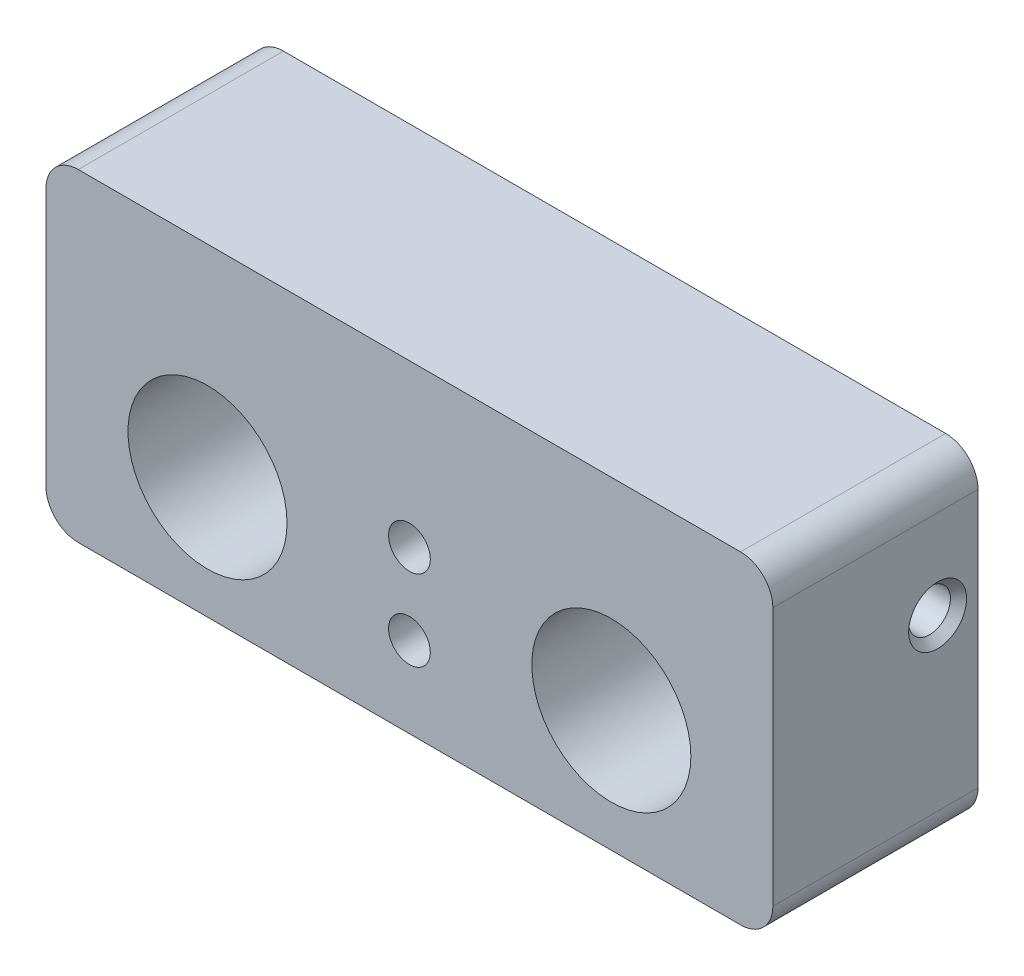
ISO-10303-21;
HEADER;
FILE_DESCRIPTION(('STEP AP214'),'2;1');
FILE_NAME('part.step','',(''),(''),'','','');
FILE_SCHEMA(('AUTOMOTIVE_DESIGN { 1 0 10303 214 1 1 1 1 }'));
ENDSEC;
DATA;
#1=APPLICATION_CONTEXT('core data for automotive mechanical design processes');
#2=APPLICATION_PROTOCOL_DEFINITION('international standard','automotive_design',2000,#1);
#3=PRODUCT_CONTEXT('',#1,'mechanical');
#4=PRODUCT('Part','Part','',(#3));
#5=PRODUCT_RELATED_PRODUCT_CATEGORY('part','',(#4));
#6=PRODUCT_DEFINITION_FORMATION('','',#4);
#7=PRODUCT_DEFINITION_CONTEXT('part definition',#1,'design');
#8=PRODUCT_DEFINITION('design','',#6,#7);
#9=PRODUCT_DEFINITION_SHAPE('','',#8);
#10=(LENGTH_UNIT() NAMED_UNIT(*) SI_UNIT(.MILLI.,.METRE.));
#11=(NAMED_UNIT(*) PLANE_ANGLE_UNIT() SI_UNIT($,.RADIAN.));
#12=(NAMED_UNIT(*) SI_UNIT($,.STERADIAN.) SOLID_ANGLE_UNIT());
#13=UNCERTAINTY_MEASURE_WITH_UNIT(LENGTH_MEASURE(1.E-05),#10,'distance_accuracy_value','');
#14=(GEOMETRIC_REPRESENTATION_CONTEXT(3) GLOBAL_UNCERTAINTY_ASSIGNED_CONTEXT((#13)) GLOBAL_UNIT_ASSIGNED_CONTEXT((#10,
#11,#12)) REPRESENTATION_CONTEXT('',''));
#15=CARTESIAN_POINT('',(0.,0.,0.));
#16=DIRECTION('',(0.,0.,1.));
#17=DIRECTION('',(1.,0.,0.));
#18=AXIS2_PLACEMENT_3D('',#15,#16,#17);
#19=CARTESIAN_POINT('',(0.,0.,12.7));
#20=DIRECTION('',(0.,0.,1.));
#21=DIRECTION('',(1.,0.,0.));
#22=AXIS2_PLACEMENT_3D('',#19,#20,#21);
#23=PLANE('',#22);
#24=CARTESIAN_POINT('',(5.81896551724137,-6.28448275862069,12.7));
#25=DIRECTION('',(0.,0.,1.));
#26=DIRECTION('',(1.,0.,0.));
#27=AXIS2_PLACEMENT_3D('',#24,#25,#26);
#28=CIRCLE('',#27,1.2923125);
#29=CARTESIAN_POINT('',(7.11127801724137,-6.28448275862069,12.7));
#30=VERTEX_POINT('',#29);
#31=EDGE_CURVE('E130',#30,#30,#28,.T.);
#32=ORIENTED_EDGE('',*,*,#31,.F.);
#33=EDGE_LOOP('',(#32));
#34=FACE_BOUND('',#33,.T.);
#35=CARTESIAN_POINT('',(5.81896551724137,-11.2844827586207,12.7));
#36=DIRECTION('',(0.,0.,1.));
#37=DIRECTION('',(1.,0.,0.));
#38=AXIS2_PLACEMENT_3D('',#35,#36,#37);
#39=CIRCLE('',#38,1.2923125);
#40=CARTESIAN_POINT('',(7.11127801724137,-11.2844827586207,12.7));
#41=VERTEX_POINT('',#40);
#42=EDGE_CURVE('E138',#41,#41,#39,.T.);
#43=ORIENTED_EDGE('',*,*,#42,.F.);
#44=EDGE_LOOP('',(#43));
#45=FACE_BOUND('',#44,.T.);
#46=CARTESIAN_POINT('',(-6.68103448275862,-8.78448275862069,12.7));
#47=DIRECTION('',(0.,0.,1.));
#48=DIRECTION('',(1.,0.,0.));
#49=AXIS2_PLACEMENT_3D('',#46,#47,#48);
#50=CIRCLE('',#49,4.9235);
#51=CARTESIAN_POINT('',(-1.75753448275862,-8.78448275862069,12.7));
#52=VERTEX_POINT('',#51);
#53=EDGE_CURVE('E151',#52,#52,#50,.T.);
#54=ORIENTED_EDGE('',*,*,#53,.F.);
#55=EDGE_LOOP('',(#54));
#56=FACE_BOUND('',#55,.T.);
#57=DIRECTION('',(1.,0.,0.));
#58=VECTOR('',#57,1.);
#59=CARTESIAN_POINT('',(-16.6810344827586,-16.2844827586207,12.7));
#60=LINE('',#59,#58);
#61=CARTESIAN_POINT('',(-14.6810344827586,-16.2844827586207,12.7));
#62=VERTEX_POINT('',#61);
#63=CARTESIAN_POINT('',(26.3189655172414,-16.2844827586207,12.7));
#64=VERTEX_POINT('',#63);
#65=EDGE_CURVE('E160',#62,#64,#60,.T.);
#66=ORIENTED_EDGE('',*,*,#65,.T.);
#67=CARTESIAN_POINT('',(26.3189655172414,-14.2844827586207,12.7));
#68=DIRECTION('',(0.,0.,1.));
#69=DIRECTION('',(1.,0.,0.));
#70=AXIS2_PLACEMENT_3D('',#67,#68,#69);
#71=CIRCLE('',#70,2.);
#72=CARTESIAN_POINT('',(28.3189655172414,-14.2844827586207,12.7));
#73=VERTEX_POINT('',#72);
#74=EDGE_CURVE('E200',#64,#73,#71,.T.);
#75=ORIENTED_EDGE('',*,*,#74,.T.);
#76=DIRECTION('',(0.,1.,0.));
#77=VECTOR('',#76,1.);
#78=CARTESIAN_POINT('',(28.3189655172414,3.71551724137931,12.7));
#79=LINE('',#78,#77);
#80=CARTESIAN_POINT('',(28.3189655172414,1.71551724137931,12.7));
#81=VERTEX_POINT('',#80);
#82=EDGE_CURVE('E164',#73,#81,#79,.T.);
#83=ORIENTED_EDGE('',*,*,#82,.T.);
#84=CARTESIAN_POINT('',(26.3189655172414,1.71551724137931,12.7));
#85=DIRECTION('',(0.,0.,1.));
#86=DIRECTION('',(1.,0.,0.));
#87=AXIS2_PLACEMENT_3D('',#84,#85,#86);
#88=CIRCLE('',#87,2.);
#89=CARTESIAN_POINT('',(26.3189655172414,3.71551724137931,12.7));
#90=VERTEX_POINT('',#89);
#91=EDGE_CURVE('E62',#81,#90,#88,.T.);
#92=ORIENTED_EDGE('',*,*,#91,.T.);
#93=DIRECTION('',(-1.,0.,0.));
#94=VECTOR('',#93,1.);
#95=CARTESIAN_POINT('',(-16.6810344827586,3.71551724137931,12.7));
#96=LINE('',#95,#94);
#97=CARTESIAN_POINT('',(-14.6810344827586,3.71551724137931,12.7));
#98=VERTEX_POINT('',#97);
#99=EDGE_CURVE('E166',#90,#98,#96,.T.);
#100=ORIENTED_EDGE('',*,*,#99,.T.);
#101=CARTESIAN_POINT('',(-14.6810344827586,1.71551724137931,12.7));
#102=DIRECTION('',(0.,0.,1.));
#103=DIRECTION('',(1.,0.,0.));
#104=AXIS2_PLACEMENT_3D('',#101,#102,#103);
#105=CIRCLE('',#104,2.);
#106=CARTESIAN_POINT('',(-16.6810344827586,1.71551724137931,12.7));
#107=VERTEX_POINT('',#106);
#108=EDGE_CURVE('E197',#98,#107,#105,.T.);
#109=ORIENTED_EDGE('',*,*,#108,.T.);
#110=DIRECTION('',(0.,-1.,0.));
#111=VECTOR('',#110,1.);
#112=CARTESIAN_POINT('',(-16.6810344827586,3.71551724137931,12.7));
#113=LINE('',#112,#111);
#114=CARTESIAN_POINT('',(-16.6810344827586,-14.2844827586207,12.7));
#115=VERTEX_POINT('',#114);
#116=EDGE_CURVE('E157',#107,#115,#113,.T.);
#117=ORIENTED_EDGE('',*,*,#116,.T.);
#118=CARTESIAN_POINT('',(-14.6810344827586,-14.2844827586207,12.7));
#119=DIRECTION('',(0.,0.,1.));
#120=DIRECTION('',(1.,0.,0.));
#121=AXIS2_PLACEMENT_3D('',#118,#119,#120);
#122=CIRCLE('',#121,2.);
#123=EDGE_CURVE('E195',#115,#62,#122,.T.);
#124=ORIENTED_EDGE('',*,*,#123,.T.);
#125=EDGE_LOOP('',(#66,#75,#83,#92,#100,#109,#117,#124));
#126=FACE_BOUND('',#125,.T.);
#127=CARTESIAN_POINT('',(18.3189655172414,-8.78448275862069,12.7));
#128=DIRECTION('',(0.,0.,1.));
#129=DIRECTION('',(1.,0.,0.));
#130=AXIS2_PLACEMENT_3D('',#127,#128,#129);
#131=CIRCLE('',#130,4.9235);
#132=CARTESIAN_POINT('',(23.2424655172414,-8.78448275862069,12.7));
#133=VERTEX_POINT('',#132);
#134=EDGE_CURVE('E145',#133,#133,#131,.T.);
#135=ORIENTED_EDGE('',*,*,#134,.F.);
#136=EDGE_LOOP('',(#135));
#137=FACE_BOUND('',#136,.T.);
#138=ADVANCED_FACE('F39',(#34,#45,#56,#126,#137),#23,.T.);
#139=CARTESIAN_POINT('',(0.,0.,0.));
#140=DIRECTION('',(0.,0.,1.));
#141=DIRECTION('',(1.,0.,0.));
#142=AXIS2_PLACEMENT_3D('',#139,#140,#141);
#143=PLANE('',#142);
#144=DIRECTION('',(0.,1.,0.));
#145=VECTOR('',#144,1.);
#146=CARTESIAN_POINT('',(28.3189655172414,3.71551724137931,0.));
#147=LINE('',#146,#145);
#148=CARTESIAN_POINT('',(28.3189655172414,-14.2844827586207,0.));
#149=VERTEX_POINT('',#148);
#150=CARTESIAN_POINT('',(28.3189655172414,1.71551724137931,0.));
#151=VERTEX_POINT('',#150);
#152=EDGE_CURVE('E174',#149,#151,#147,.T.);
#153=ORIENTED_EDGE('',*,*,#152,.F.);
#154=CARTESIAN_POINT('',(26.3189655172414,-14.2844827586207,0.));
#155=DIRECTION('',(0.,0.,1.));
#156=DIRECTION('',(1.,0.,0.));
#157=AXIS2_PLACEMENT_3D('',#154,#155,#156);
#158=CIRCLE('',#157,2.);
#159=CARTESIAN_POINT('',(26.3189655172414,-16.2844827586207,0.));
#160=VERTEX_POINT('',#159);
#161=EDGE_CURVE('E188',#149,#160,#158,.F.);
#162=ORIENTED_EDGE('',*,*,#161,.T.);
#163=DIRECTION('',(1.,0.,0.));
#164=VECTOR('',#163,1.);
#165=CARTESIAN_POINT('',(-16.6810344827586,-16.2844827586207,0.));
#166=LINE('',#165,#164);
#167=CARTESIAN_POINT('',(-14.6810344827586,-16.2844827586207,0.));
#168=VERTEX_POINT('',#167);
#169=EDGE_CURVE('E171',#168,#160,#166,.T.);
#170=ORIENTED_EDGE('',*,*,#169,.F.);
#171=CARTESIAN_POINT('',(-14.6810344827586,-14.2844827586207,0.));
#172=DIRECTION('',(0.,0.,1.));
#173=DIRECTION('',(1.,0.,0.));
#174=AXIS2_PLACEMENT_3D('',#171,#172,#173);
#175=CIRCLE('',#174,2.);
#176=CARTESIAN_POINT('',(-16.6810344827586,-14.2844827586207,0.));
#177=VERTEX_POINT('',#176);
#178=EDGE_CURVE('E182',#168,#177,#175,.F.);
#179=ORIENTED_EDGE('',*,*,#178,.T.);
#180=DIRECTION('',(0.,-1.,0.));
#181=VECTOR('',#180,1.);
#182=CARTESIAN_POINT('',(-16.6810344827586,3.71551724137931,0.));
#183=LINE('',#182,#181);
#184=CARTESIAN_POINT('',(-16.6810344827586,1.71551724137931,0.));
#185=VERTEX_POINT('',#184);
#186=EDGE_CURVE('E154',#185,#177,#183,.T.);
#187=ORIENTED_EDGE('',*,*,#186,.F.);
#188=CARTESIAN_POINT('',(-14.6810344827586,1.71551724137931,0.));
#189=DIRECTION('',(0.,0.,1.));
#190=DIRECTION('',(1.,0.,0.));
#191=AXIS2_PLACEMENT_3D('',#188,#189,#190);
#192=CIRCLE('',#191,2.);
#193=CARTESIAN_POINT('',(-14.6810344827586,3.71551724137931,0.));
#194=VERTEX_POINT('',#193);
#195=EDGE_CURVE('E184',#185,#194,#192,.F.);
#196=ORIENTED_EDGE('',*,*,#195,.T.);
#197=DIRECTION('',(-1.,0.,0.));
#198=VECTOR('',#197,1.);
#199=CARTESIAN_POINT('',(-16.6810344827586,3.71551724137931,0.));
#200=LINE('',#199,#198);
#201=CARTESIAN_POINT('',(26.3189655172414,3.71551724137931,0.));
#202=VERTEX_POINT('',#201);
#203=EDGE_CURVE('E161',#202,#194,#200,.T.);
#204=ORIENTED_EDGE('',*,*,#203,.F.);
#205=CARTESIAN_POINT('',(26.3189655172414,1.71551724137931,0.));
#206=DIRECTION('',(0.,0.,1.));
#207=DIRECTION('',(1.,0.,0.));
#208=AXIS2_PLACEMENT_3D('',#205,#206,#207);
#209=CIRCLE('',#208,2.);
#210=EDGE_CURVE('E186',#202,#151,#209,.F.);
#211=ORIENTED_EDGE('',*,*,#210,.T.);
#212=EDGE_LOOP('',(#153,#162,#170,#179,#187,#196,#204,#211));
#213=FACE_BOUND('',#212,.T.);
#214=CARTESIAN_POINT('',(-6.68103448275862,-8.78448275862069,0.));
#215=DIRECTION('',(0.,0.,1.));
#216=DIRECTION('',(1.,0.,0.));
#217=AXIS2_PLACEMENT_3D('',#214,#215,#216);
#218=CIRCLE('',#217,4.9235);
#219=CARTESIAN_POINT('',(-1.75753448275862,-8.78448275862069,0.));
#220=VERTEX_POINT('',#219);
#221=EDGE_CURVE('E148',#220,#220,#218,.T.);
#222=ORIENTED_EDGE('',*,*,#221,.T.);
#223=EDGE_LOOP('',(#222));
#224=FACE_BOUND('',#223,.T.);
#225=CARTESIAN_POINT('',(18.3189655172414,-8.78448275862069,0.));
#226=DIRECTION('',(0.,0.,1.));
#227=DIRECTION('',(1.,0.,0.));
#228=AXIS2_PLACEMENT_3D('',#225,#226,#227);
#229=CIRCLE('',#228,4.9235);
#230=CARTESIAN_POINT('',(23.2424655172414,-8.78448275862069,0.));
#231=VERTEX_POINT('',#230);
#232=EDGE_CURVE('E144',#231,#231,#229,.T.);
#233=ORIENTED_EDGE('',*,*,#232,.T.);
#234=EDGE_LOOP('',(#233));
#235=FACE_BOUND('',#234,.T.);
#236=ADVANCED_FACE('F230',(#213,#224,#235),#143,.F.);
#237=CARTESIAN_POINT('',(-16.6810344827586,3.71551724137931,12.7));
#238=DIRECTION('',(1.,0.,0.));
#239=DIRECTION('',(0.,1.,0.));
#240=AXIS2_PLACEMENT_3D('',#237,#238,#239);
#241=PLANE('',#240);
#242=CARTESIAN_POINT('',(-16.6810344827586,-3.78448275862069,2.5));
#243=DIRECTION('',(1.,0.,0.));
#244=DIRECTION('',(0.,1.,0.));
#245=AXIS2_PLACEMENT_3D('',#242,#243,#244);
#246=CIRCLE('',#245,1.79231249999999);
#247=CARTESIAN_POINT('',(-16.6810344827586,-1.99217025862069,2.5));
#248=VERTEX_POINT('',#247);
#249=EDGE_CURVE('E11',#248,#248,#246,.T.);
#250=ORIENTED_EDGE('',*,*,#249,.T.);
#251=EDGE_LOOP('',(#250));
#252=FACE_BOUND('',#251,.T.);
#253=ORIENTED_EDGE('',*,*,#116,.F.);
#254=DIRECTION('',(0.,0.,-1.));
#255=VECTOR('',#254,1.);
#256=CARTESIAN_POINT('',(-16.6810344827586,1.71551724137931,12.7));
#257=LINE('',#256,#255);
#258=EDGE_CURVE('E208',#107,#185,#257,.T.);
#259=ORIENTED_EDGE('',*,*,#258,.T.);
#260=ORIENTED_EDGE('',*,*,#186,.T.);
#261=DIRECTION('',(0.,0.,-1.));
#262=VECTOR('',#261,1.);
#263=CARTESIAN_POINT('',(-16.6810344827586,-14.2844827586207,12.7));
#264=LINE('',#263,#262);
#265=EDGE_CURVE('E206',#177,#115,#264,.F.);
#266=ORIENTED_EDGE('',*,*,#265,.T.);
#267=EDGE_LOOP('',(#253,#259,#260,#266));
#268=FACE_BOUND('',#267,.T.);
#269=ADVANCED_FACE('F236',(#252,#268),#241,.F.);
#270=CARTESIAN_POINT('',(-16.6810344827586,-16.2844827586207,12.7));
#271=DIRECTION('',(0.,1.,0.));
#272=DIRECTION('',(0.,0.,1.));
#273=AXIS2_PLACEMENT_3D('',#270,#271,#272);
#274=PLANE('',#273);
#275=ORIENTED_EDGE('',*,*,#169,.T.);
#276=DIRECTION('',(0.,0.,-1.));
#277=VECTOR('',#276,1.);
#278=CARTESIAN_POINT('',(26.3189655172414,-16.2844827586207,12.7));
#279=LINE('',#278,#277);
#280=EDGE_CURVE('E193',#160,#64,#279,.F.);
#281=ORIENTED_EDGE('',*,*,#280,.T.);
#282=ORIENTED_EDGE('',*,*,#65,.F.);
#283=DIRECTION('',(0.,0.,-1.));
#284=VECTOR('',#283,1.);
#285=CARTESIAN_POINT('',(-14.6810344827586,-16.2844827586207,12.7));
#286=LINE('',#285,#284);
#287=EDGE_CURVE('E190',#62,#168,#286,.T.);
#288=ORIENTED_EDGE('',*,*,#287,.T.);
#289=EDGE_LOOP('',(#275,#281,#282,#288));
#290=FACE_BOUND('',#289,.T.);
#291=ADVANCED_FACE('F251',(#290),#274,.F.);
#292=CARTESIAN_POINT('',(28.3189655172414,3.71551724137931,12.7));
#293=DIRECTION('',(-1.,0.,0.));
#294=DIRECTION('',(0.,-1.,0.));
#295=AXIS2_PLACEMENT_3D('',#292,#293,#294);
#296=PLANE('',#295);
#297=CARTESIAN_POINT('',(28.3189655172414,-3.78448275862068,2.5));
#298=DIRECTION('',(-1.,0.,0.));
#299=DIRECTION('',(0.,-1.,0.));
#300=AXIS2_PLACEMENT_3D('',#297,#298,#299);
#301=CIRCLE('',#300,1.79231250000001);
#302=CARTESIAN_POINT('',(28.3189655172414,-5.57679525862069,2.5));
#303=VERTEX_POINT('',#302);
#304=EDGE_CURVE('E214',#303,#303,#301,.T.);
#305=ORIENTED_EDGE('',*,*,#304,.T.);
#306=EDGE_LOOP('',(#305));
#307=FACE_BOUND('',#306,.T.);
#308=ORIENTED_EDGE('',*,*,#82,.F.);
#309=DIRECTION('',(0.,0.,-1.));
#310=VECTOR('',#309,1.);
#311=CARTESIAN_POINT('',(28.3189655172414,-14.2844827586207,12.7));
#312=LINE('',#311,#310);
#313=EDGE_CURVE('E179',#73,#149,#312,.T.);
#314=ORIENTED_EDGE('',*,*,#313,.T.);
#315=ORIENTED_EDGE('',*,*,#152,.T.);
#316=DIRECTION('',(0.,0.,-1.));
#317=VECTOR('',#316,1.);
#318=CARTESIAN_POINT('',(28.3189655172414,1.71551724137931,12.7));
#319=LINE('',#318,#317);
#320=EDGE_CURVE('E168',#151,#81,#319,.F.);
#321=ORIENTED_EDGE('',*,*,#320,.T.);
#322=EDGE_LOOP('',(#308,#314,#315,#321));
#323=FACE_BOUND('',#322,.T.);
#324=ADVANCED_FACE('F248',(#307,#323),#296,.F.);
#325=CARTESIAN_POINT('',(-16.6810344827586,3.71551724137931,12.7));
#326=DIRECTION('',(0.,-1.,0.));
#327=DIRECTION('',(0.,0.,-1.));
#328=AXIS2_PLACEMENT_3D('',#325,#326,#327);
#329=PLANE('',#328);
#330=ORIENTED_EDGE('',*,*,#99,.F.);
#331=DIRECTION('',(0.,0.,-1.));
#332=VECTOR('',#331,1.);
#333=CARTESIAN_POINT('',(26.3189655172414,3.71551724137931,12.7));
#334=LINE('',#333,#332);
#335=EDGE_CURVE('E203',#90,#202,#334,.T.);
#336=ORIENTED_EDGE('',*,*,#335,.T.);
#337=ORIENTED_EDGE('',*,*,#203,.T.);
#338=DIRECTION('',(0.,0.,-1.));
#339=VECTOR('',#338,1.);
#340=CARTESIAN_POINT('',(-14.6810344827586,3.71551724137931,12.7));
#341=LINE('',#340,#339);
#342=EDGE_CURVE('E55',#194,#98,#341,.F.);
#343=ORIENTED_EDGE('',*,*,#342,.T.);
#344=EDGE_LOOP('',(#330,#336,#337,#343));
#345=FACE_BOUND('',#344,.T.);
#346=ADVANCED_FACE('F245',(#345),#329,.F.);
#347=CARTESIAN_POINT('',(-6.68103448275862,-8.78448275862069,12.7));
#348=DIRECTION('',(0.,0.,-1.));
#349=DIRECTION('',(-1.,0.,0.));
#350=AXIS2_PLACEMENT_3D('',#347,#348,#349);
#351=CYLINDRICAL_SURFACE('',#350,4.9235);
#352=ORIENTED_EDGE('',*,*,#53,.T.);
#353=EDGE_LOOP('',(#352));
#354=FACE_BOUND('',#353,.T.);
#355=ORIENTED_EDGE('',*,*,#221,.F.);
#356=EDGE_LOOP('',(#355));
#357=FACE_BOUND('',#356,.T.);
#358=ADVANCED_FACE('F242',(#354,#357),#351,.F.);
#359=CARTESIAN_POINT('',(18.3189655172414,-8.78448275862069,12.7));
#360=DIRECTION('',(0.,0.,-1.));
#361=DIRECTION('',(-1.,0.,0.));
#362=AXIS2_PLACEMENT_3D('',#359,#360,#361);
#363=CYLINDRICAL_SURFACE('',#362,4.9235);
#364=ORIENTED_EDGE('',*,*,#134,.T.);
#365=EDGE_LOOP('',(#364));
#366=FACE_BOUND('',#365,.T.);
#367=ORIENTED_EDGE('',*,*,#232,.F.);
#368=EDGE_LOOP('',(#367));
#369=FACE_BOUND('',#368,.T.);
#370=ADVANCED_FACE('F311',(#366,#369),#363,.F.);
#371=CARTESIAN_POINT('',(5.81896551724137,-11.2844827586207,2.7));
#372=DIRECTION('',(0.,0.,1.));
#373=DIRECTION('',(1.,0.,0.));
#374=AXIS2_PLACEMENT_3D('',#371,#372,#373);
#375=CONICAL_SURFACE('',#374,1.2923125,1.02974425867665);
#376=CARTESIAN_POINT('',(5.81896551724137,-11.2844827586207,1.92350031127294));
#377=VERTEX_POINT('',#376);
#378=VERTEX_LOOP('',#377);
#379=FACE_BOUND('',#378,.T.);
#380=CARTESIAN_POINT('',(5.81896551724137,-11.2844827586207,2.7));
#381=DIRECTION('',(0.,0.,1.));
#382=DIRECTION('',(1.,0.,0.));
#383=AXIS2_PLACEMENT_3D('',#380,#381,#382);
#384=CIRCLE('',#383,1.2923125);
#385=CARTESIAN_POINT('',(7.11127801724137,-11.2844827586207,2.7));
#386=VERTEX_POINT('',#385);
#387=EDGE_CURVE('E141',#386,#386,#384,.T.);
#388=ORIENTED_EDGE('',*,*,#387,.T.);
#389=EDGE_LOOP('',(#388));
#390=FACE_BOUND('',#389,.T.);
#391=ADVANCED_FACE('F313',(#379,#390),#375,.F.);
#392=CARTESIAN_POINT('',(5.81896551724137,-11.2844827586207,12.7));
#393=DIRECTION('',(0.,0.,1.));
#394=DIRECTION('',(1.,0.,0.));
#395=AXIS2_PLACEMENT_3D('',#392,#393,#394);
#396=CYLINDRICAL_SURFACE('',#395,1.2923125);
#397=ORIENTED_EDGE('',*,*,#387,.F.);
#398=EDGE_LOOP('',(#397));
#399=FACE_BOUND('',#398,.T.);
#400=ORIENTED_EDGE('',*,*,#42,.T.);
#401=EDGE_LOOP('',(#400));
#402=FACE_BOUND('',#401,.T.);
#403=ADVANCED_FACE('F319',(#399,#402),#396,.F.);
#404=CARTESIAN_POINT('',(5.81896551724137,-6.28448275862069,2.7));
#405=DIRECTION('',(0.,0.,1.));
#406=DIRECTION('',(1.,0.,0.));
#407=AXIS2_PLACEMENT_3D('',#404,#405,#406);
#408=CONICAL_SURFACE('',#407,1.2923125,1.02974425867665);
#409=CARTESIAN_POINT('',(5.81896551724137,-6.28448275862069,1.92350031127294));
#410=VERTEX_POINT('',#409);
#411=VERTEX_LOOP('',#410);
#412=FACE_BOUND('',#411,.T.);
#413=CARTESIAN_POINT('',(5.81896551724137,-6.28448275862069,2.7));
#414=DIRECTION('',(0.,0.,1.));
#415=DIRECTION('',(1.,0.,0.));
#416=AXIS2_PLACEMENT_3D('',#413,#414,#415);
#417=CIRCLE('',#416,1.2923125);
#418=CARTESIAN_POINT('',(7.11127801724137,-6.28448275862069,2.7));
#419=VERTEX_POINT('',#418);
#420=EDGE_CURVE('E135',#419,#419,#417,.T.);
#421=ORIENTED_EDGE('',*,*,#420,.T.);
#422=EDGE_LOOP('',(#421));
#423=FACE_BOUND('',#422,.T.);
#424=ADVANCED_FACE('F326',(#412,#423),#408,.F.);
#425=CARTESIAN_POINT('',(5.81896551724137,-6.28448275862069,12.7));
#426=DIRECTION('',(0.,0.,1.));
#427=DIRECTION('',(1.,0.,0.));
#428=AXIS2_PLACEMENT_3D('',#425,#426,#427);
#429=CYLINDRICAL_SURFACE('',#428,1.2923125);
#430=ORIENTED_EDGE('',*,*,#420,.F.);
#431=EDGE_LOOP('',(#430));
#432=FACE_BOUND('',#431,.T.);
#433=ORIENTED_EDGE('',*,*,#31,.T.);
#434=EDGE_LOOP('',(#433));
#435=FACE_BOUND('',#434,.T.);
#436=ADVANCED_FACE('F263',(#432,#435),#429,.F.);
#437=CARTESIAN_POINT('',(26.3189655172414,-14.2844827586207,12.7));
#438=DIRECTION('',(0.,0.,-1.));
#439=DIRECTION('',(-1.,0.,0.));
#440=AXIS2_PLACEMENT_3D('',#437,#438,#439);
#441=CYLINDRICAL_SURFACE('',#440,2.);
#442=ORIENTED_EDGE('',*,*,#74,.F.);
#443=ORIENTED_EDGE('',*,*,#280,.F.);
#444=ORIENTED_EDGE('',*,*,#161,.F.);
#445=ORIENTED_EDGE('',*,*,#313,.F.);
#446=EDGE_LOOP('',(#442,#443,#444,#445));
#447=FACE_BOUND('',#446,.T.);
#448=ADVANCED_FACE('F259',(#447),#441,.T.);
#449=CARTESIAN_POINT('',(26.3189655172414,1.71551724137931,12.7));
#450=DIRECTION('',(0.,0.,-1.));
#451=DIRECTION('',(-1.,0.,0.));
#452=AXIS2_PLACEMENT_3D('',#449,#450,#451);
#453=CYLINDRICAL_SURFACE('',#452,2.);
#454=ORIENTED_EDGE('',*,*,#91,.F.);
#455=ORIENTED_EDGE('',*,*,#320,.F.);
#456=ORIENTED_EDGE('',*,*,#210,.F.);
#457=ORIENTED_EDGE('',*,*,#335,.F.);
#458=EDGE_LOOP('',(#454,#455,#456,#457));
#459=FACE_BOUND('',#458,.T.);
#460=ADVANCED_FACE('F262',(#459),#453,.T.);
#461=CARTESIAN_POINT('',(-14.6810344827586,1.71551724137931,12.7));
#462=DIRECTION('',(0.,0.,-1.));
#463=DIRECTION('',(-1.,0.,0.));
#464=AXIS2_PLACEMENT_3D('',#461,#462,#463);
#465=CYLINDRICAL_SURFACE('',#464,2.);
#466=ORIENTED_EDGE('',*,*,#108,.F.);
#467=ORIENTED_EDGE('',*,*,#342,.F.);
#468=ORIENTED_EDGE('',*,*,#195,.F.);
#469=ORIENTED_EDGE('',*,*,#258,.F.);
#470=EDGE_LOOP('',(#466,#467,#468,#469));
#471=FACE_BOUND('',#470,.T.);
#472=ADVANCED_FACE('F267',(#471),#465,.T.);
#473=CARTESIAN_POINT('',(-14.6810344827586,-14.2844827586207,12.7));
#474=DIRECTION('',(0.,0.,-1.));
#475=DIRECTION('',(-1.,0.,0.));
#476=AXIS2_PLACEMENT_3D('',#473,#474,#475);
#477=CYLINDRICAL_SURFACE('',#476,2.);
#478=ORIENTED_EDGE('',*,*,#123,.F.);
#479=ORIENTED_EDGE('',*,*,#265,.F.);
#480=ORIENTED_EDGE('',*,*,#178,.F.);
#481=ORIENTED_EDGE('',*,*,#287,.F.);
#482=EDGE_LOOP('',(#478,#479,#480,#481));
#483=FACE_BOUND('',#482,.T.);
#484=ADVANCED_FACE('F271',(#483),#477,.T.);
#485=CARTESIAN_POINT('',(-11.6810344827586,-3.78448275862069,2.5));
#486=DIRECTION('',(-1.,0.,0.));
#487=DIRECTION('',(0.,0.,1.));
#488=AXIS2_PLACEMENT_3D('',#485,#486,#487);
#489=CONICAL_SURFACE('',#488,1.2923125,1.02974425867665);
#490=CARTESIAN_POINT('',(-10.9045347940316,-3.78448275862069,2.5));
#491=VERTEX_POINT('',#490);
#492=VERTEX_LOOP('',#491);
#493=FACE_BOUND('',#492,.T.);
#494=CARTESIAN_POINT('',(-11.6810344827586,-3.78448275862069,2.5));
#495=DIRECTION('',(-1.,0.,0.));
#496=DIRECTION('',(0.,0.,1.));
#497=AXIS2_PLACEMENT_3D('',#494,#495,#496);
#498=CIRCLE('',#497,1.2923125);
#499=CARTESIAN_POINT('',(-11.6810344827586,-3.78448275862069,3.7923125));
#500=VERTEX_POINT('',#499);
#501=EDGE_CURVE('E127',#500,#500,#498,.T.);
#502=ORIENTED_EDGE('',*,*,#501,.T.);
#503=EDGE_LOOP('',(#502));
#504=FACE_BOUND('',#503,.T.);
#505=ADVANCED_FACE('F274',(#493,#504),#489,.F.);
#506=CARTESIAN_POINT('',(-16.6810344827586,-3.78448275862069,2.5));
#507=DIRECTION('',(-1.,0.,0.));
#508=DIRECTION('',(0.,0.,1.));
#509=AXIS2_PLACEMENT_3D('',#506,#507,#508);
#510=CYLINDRICAL_SURFACE('',#509,1.2923125);
#511=CARTESIAN_POINT('',(-16.1810344827586,-3.78448275862069,2.5));
#512=DIRECTION('',(1.,0.,0.));
#513=DIRECTION('',(0.,0.,-1.));
#514=AXIS2_PLACEMENT_3D('',#511,#512,#513);
#515=CIRCLE('',#514,1.2923125);
#516=CARTESIAN_POINT('',(-16.1810344827586,-3.78448275862069,1.2076875));
#517=VERTEX_POINT('',#516);
#518=EDGE_CURVE('E48',#517,#517,#515,.F.);
#519=ORIENTED_EDGE('',*,*,#518,.T.);
#520=EDGE_LOOP('',(#519));
#521=FACE_BOUND('',#520,.T.);
#522=ORIENTED_EDGE('',*,*,#501,.F.);
#523=EDGE_LOOP('',(#522));
#524=FACE_BOUND('',#523,.T.);
#525=ADVANCED_FACE('F121',(#521,#524),#510,.F.);
#526=CARTESIAN_POINT('',(23.3189655172414,-3.78448275862068,2.5));
#527=DIRECTION('',(1.,0.,0.));
#528=DIRECTION('',(0.,0.,-1.));
#529=AXIS2_PLACEMENT_3D('',#526,#527,#528);
#530=CONICAL_SURFACE('',#529,1.2923125,1.02974425867665);
#531=CARTESIAN_POINT('',(22.5424658285143,-3.78448275862068,2.5));
#532=VERTEX_POINT('',#531);
#533=VERTEX_LOOP('',#532);
#534=FACE_BOUND('',#533,.T.);
#535=CARTESIAN_POINT('',(23.3189655172414,-3.78448275862068,2.5));
#536=DIRECTION('',(1.,0.,0.));
#537=DIRECTION('',(0.,0.,-1.));
#538=AXIS2_PLACEMENT_3D('',#535,#536,#537);
#539=CIRCLE('',#538,1.2923125);
#540=CARTESIAN_POINT('',(23.3189655172414,-3.78448275862068,1.2076875));
#541=VERTEX_POINT('',#540);
#542=EDGE_CURVE('E125',#541,#541,#539,.T.);
#543=ORIENTED_EDGE('',*,*,#542,.T.);
#544=EDGE_LOOP('',(#543));
#545=FACE_BOUND('',#544,.T.);
#546=ADVANCED_FACE('F117',(#534,#545),#530,.F.);
#547=CARTESIAN_POINT('',(28.3189655172414,-3.78448275862068,2.5));
#548=DIRECTION('',(1.,0.,0.));
#549=DIRECTION('',(0.,0.,-1.));
#550=AXIS2_PLACEMENT_3D('',#547,#548,#549);
#551=CYLINDRICAL_SURFACE('',#550,1.2923125);
#552=CARTESIAN_POINT('',(27.8189655172414,-3.78448275862068,2.5));
#553=DIRECTION('',(-1.,0.,0.));
#554=DIRECTION('',(0.,0.,1.));
#555=AXIS2_PLACEMENT_3D('',#552,#553,#554);
#556=CIRCLE('',#555,1.2923125);
#557=CARTESIAN_POINT('',(27.8189655172414,-3.78448275862068,3.7923125));
#558=VERTEX_POINT('',#557);
#559=EDGE_CURVE('E211',#558,#558,#556,.F.);
#560=ORIENTED_EDGE('',*,*,#559,.T.);
#561=EDGE_LOOP('',(#560));
#562=FACE_BOUND('',#561,.T.);
#563=ORIENTED_EDGE('',*,*,#542,.F.);
#564=EDGE_LOOP('',(#563));
#565=FACE_BOUND('',#564,.T.);
#566=ADVANCED_FACE('F120',(#562,#565),#551,.F.);
#567=CARTESIAN_POINT('',(27.8189655172414,-3.78448275862068,2.5));
#568=DIRECTION('',(1.,0.,0.));
#569=DIRECTION('',(0.,0.,-1.));
#570=AXIS2_PLACEMENT_3D('',#567,#568,#569);
#571=CONICAL_SURFACE('',#570,1.2923125,0.785398163397457);
#572=ORIENTED_EDGE('',*,*,#304,.F.);
#573=EDGE_LOOP('',(#572));
#574=FACE_BOUND('',#573,.T.);
#575=ORIENTED_EDGE('',*,*,#559,.F.);
#576=EDGE_LOOP('',(#575));
#577=FACE_BOUND('',#576,.T.);
#578=ADVANCED_FACE('F222',(#574,#577),#571,.F.);
#579=CARTESIAN_POINT('',(-16.1810344827586,-3.78448275862069,2.5));
#580=DIRECTION('',(-1.,0.,0.));
#581=DIRECTION('',(0.,0.,1.));
#582=AXIS2_PLACEMENT_3D('',#579,#580,#581);
#583=CONICAL_SURFACE('',#582,1.2923125,0.785398163397448);
#584=ORIENTED_EDGE('',*,*,#249,.F.);
#585=EDGE_LOOP('',(#584));
#586=FACE_BOUND('',#585,.T.);
#587=ORIENTED_EDGE('',*,*,#518,.F.);
#588=EDGE_LOOP('',(#587));
#589=FACE_BOUND('',#588,.T.);
#590=ADVANCED_FACE('F42',(#586,#589),#583,.F.);
#591=CLOSED_SHELL('',(#138,#236,#269,#291,#324,#346,#358,#370,#391,#403,#424,#436,#448,#460,
#472,#484,#505,#525,#546,#566,#578,#590));
#592=MANIFOLD_SOLID_BREP('B2',#591);
#593=ADVANCED_BREP_SHAPE_REPRESENTATION('',(#18,#592),#14);
#594=SHAPE_DEFINITION_REPRESENTATION(#9,#593);
ENDSEC;
END-ISO-10303-21;
